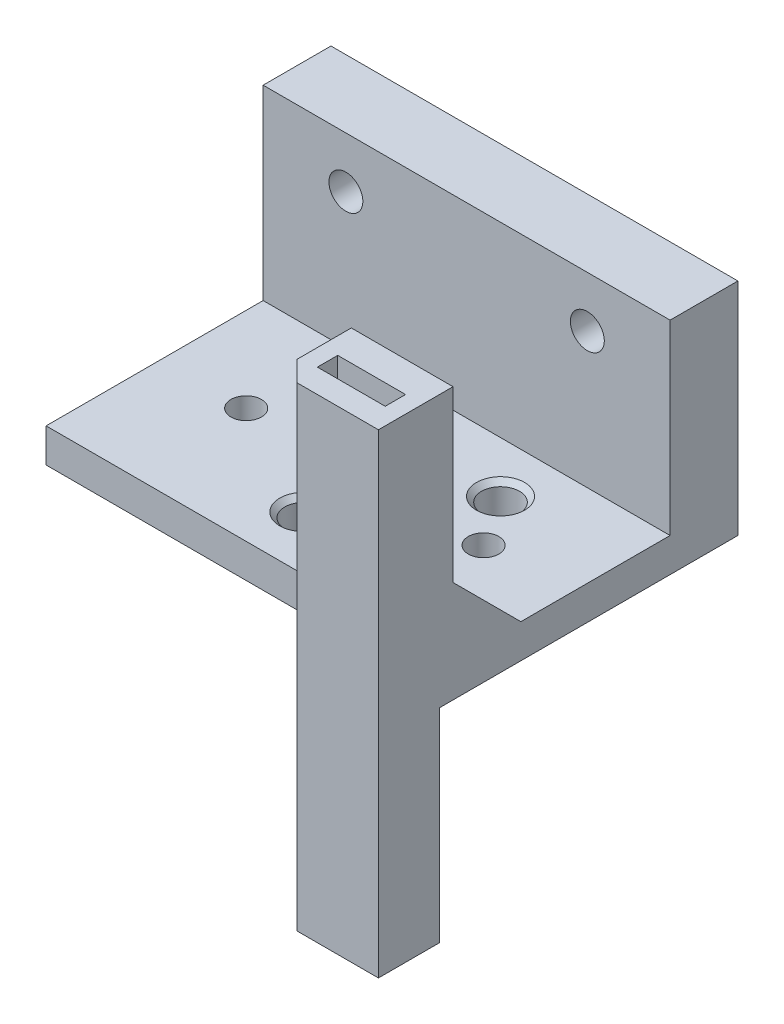
ISO-10303-21;
HEADER;
FILE_DESCRIPTION(('STEP AP214'),'2;1');
FILE_NAME('part.step','',(''),(''),'','','');
FILE_SCHEMA(('AUTOMOTIVE_DESIGN { 1 0 10303 214 1 1 1 1 }'));
ENDSEC;
DATA;
#1=APPLICATION_CONTEXT('core data for automotive mechanical design processes');
#2=APPLICATION_PROTOCOL_DEFINITION('international standard','automotive_design',2000,#1);
#3=PRODUCT_CONTEXT('',#1,'mechanical');
#4=PRODUCT('Part','Part','',(#3));
#5=PRODUCT_RELATED_PRODUCT_CATEGORY('part','',(#4));
#6=PRODUCT_DEFINITION_FORMATION('','',#4);
#7=PRODUCT_DEFINITION_CONTEXT('part definition',#1,'design');
#8=PRODUCT_DEFINITION('design','',#6,#7);
#9=PRODUCT_DEFINITION_SHAPE('','',#8);
#10=(LENGTH_UNIT() NAMED_UNIT(*) SI_UNIT(.MILLI.,.METRE.));
#11=(NAMED_UNIT(*) PLANE_ANGLE_UNIT() SI_UNIT($,.RADIAN.));
#12=(NAMED_UNIT(*) SI_UNIT($,.STERADIAN.) SOLID_ANGLE_UNIT());
#13=UNCERTAINTY_MEASURE_WITH_UNIT(LENGTH_MEASURE(1.E-05),#10,'distance_accuracy_value','');
#14=(GEOMETRIC_REPRESENTATION_CONTEXT(3) GLOBAL_UNCERTAINTY_ASSIGNED_CONTEXT((#13)) GLOBAL_UNIT_ASSIGNED_CONTEXT((#10,
#11,#12)) REPRESENTATION_CONTEXT('',''));
#15=CARTESIAN_POINT('',(0.,0.,0.));
#16=DIRECTION('',(0.,0.,1.));
#17=DIRECTION('',(1.,0.,0.));
#18=AXIS2_PLACEMENT_3D('',#15,#16,#17);
#19=CARTESIAN_POINT('',(0.,5.,0.));
#20=DIRECTION('',(0.,-1.,0.));
#21=DIRECTION('',(0.,0.,-1.));
#22=AXIS2_PLACEMENT_3D('',#19,#20,#21);
#23=PLANE('',#22);
#24=CARTESIAN_POINT('',(-17.5,5.,-15.));
#25=DIRECTION('',(0.,1.,0.));
#26=DIRECTION('',(0.,0.,1.));
#27=AXIS2_PLACEMENT_3D('',#24,#25,#26);
#28=CIRCLE('',#27,2.25);
#29=CARTESIAN_POINT('',(-17.5,5.,-12.75));
#30=VERTEX_POINT('',#29);
#31=EDGE_CURVE('E223',#30,#30,#28,.T.);
#32=ORIENTED_EDGE('',*,*,#31,.F.);
#33=EDGE_LOOP('',(#32));
#34=FACE_BOUND('',#33,.T.);
#35=CARTESIAN_POINT('',(17.5,5.,-15.));
#36=DIRECTION('',(0.,1.,0.));
#37=DIRECTION('',(0.,0.,1.));
#38=AXIS2_PLACEMENT_3D('',#35,#36,#37);
#39=CIRCLE('',#38,2.25);
#40=CARTESIAN_POINT('',(17.5,5.,-12.75));
#41=VERTEX_POINT('',#40);
#42=EDGE_CURVE('E215',#41,#41,#39,.T.);
#43=ORIENTED_EDGE('',*,*,#42,.F.);
#44=EDGE_LOOP('',(#43));
#45=FACE_BOUND('',#44,.T.);
#46=CARTESIAN_POINT('',(12.5,5.,-22.5));
#47=DIRECTION('',(0.,-1.,0.));
#48=DIRECTION('',(0.,0.,-1.));
#49=AXIS2_PLACEMENT_3D('',#46,#47,#48);
#50=CIRCLE('',#49,3.55000000000002);
#51=CARTESIAN_POINT('',(12.5,5.,-26.05));
#52=VERTEX_POINT('',#51);
#53=EDGE_CURVE('E285',#52,#52,#50,.T.);
#54=ORIENTED_EDGE('',*,*,#53,.T.);
#55=EDGE_LOOP('',(#54));
#56=FACE_BOUND('',#55,.T.);
#57=CARTESIAN_POINT('',(-12.5,5.,-22.5));
#58=DIRECTION('',(0.,-1.,0.));
#59=DIRECTION('',(0.,0.,-1.));
#60=AXIS2_PLACEMENT_3D('',#57,#58,#59);
#61=CIRCLE('',#60,3.55000000000002);
#62=CARTESIAN_POINT('',(-12.5,5.,-26.05));
#63=VERTEX_POINT('',#62);
#64=EDGE_CURVE('E289',#63,#63,#61,.T.);
#65=ORIENTED_EDGE('',*,*,#64,.T.);
#66=EDGE_LOOP('',(#65));
#67=FACE_BOUND('',#66,.T.);
#68=CARTESIAN_POINT('',(0.,5.,-6.));
#69=DIRECTION('',(0.,-1.,0.));
#70=DIRECTION('',(0.,0.,-1.));
#71=AXIS2_PLACEMENT_3D('',#68,#69,#70);
#72=CIRCLE('',#71,3.55000000000002);
#73=CARTESIAN_POINT('',(0.,5.,-9.55000000000002));
#74=VERTEX_POINT('',#73);
#75=EDGE_CURVE('E293',#74,#74,#72,.T.);
#76=ORIENTED_EDGE('',*,*,#75,.T.);
#77=EDGE_LOOP('',(#76));
#78=FACE_BOUND('',#77,.T.);
#79=DIRECTION('',(1.,0.,0.));
#80=VECTOR('',#79,1.);
#81=CARTESIAN_POINT('',(0.,5.,-8.00000000000008));
#82=LINE('',#81,#80);
#83=CARTESIAN_POINT('',(9.99999999999997,5.,-8.00000000000008));
#84=VERTEX_POINT('',#83);
#85=CARTESIAN_POINT('',(30.,5.,-8.00000000000005));
#86=VERTEX_POINT('',#85);
#87=EDGE_CURVE('E62',#84,#86,#82,.T.);
#88=ORIENTED_EDGE('',*,*,#87,.T.);
#89=DIRECTION('',(0.,0.,1.));
#90=VECTOR('',#89,1.);
#91=CARTESIAN_POINT('',(30.,5.,-30.));
#92=LINE('',#91,#90);
#93=CARTESIAN_POINT('',(30.,5.,-30.));
#94=VERTEX_POINT('',#93);
#95=EDGE_CURVE('E195',#94,#86,#92,.T.);
#96=ORIENTED_EDGE('',*,*,#95,.F.);
#97=DIRECTION('',(1.,0.,0.));
#98=VECTOR('',#97,1.);
#99=CARTESIAN_POINT('',(-30.,5.,-30.));
#100=LINE('',#99,#98);
#101=CARTESIAN_POINT('',(-30.,5.,-30.));
#102=VERTEX_POINT('',#101);
#103=EDGE_CURVE('E190',#102,#94,#100,.T.);
#104=ORIENTED_EDGE('',*,*,#103,.F.);
#105=DIRECTION('',(0.,0.,1.));
#106=VECTOR('',#105,1.);
#107=CARTESIAN_POINT('',(-30.,5.,0.));
#108=LINE('',#107,#106);
#109=CARTESIAN_POINT('',(-30.,5.,2.));
#110=VERTEX_POINT('',#109);
#111=EDGE_CURVE('E243',#102,#110,#108,.T.);
#112=ORIENTED_EDGE('',*,*,#111,.T.);
#113=DIRECTION('',(1.,0.,0.));
#114=VECTOR('',#113,1.);
#115=CARTESIAN_POINT('',(-30.,5.,2.));
#116=LINE('',#115,#114);
#117=CARTESIAN_POINT('',(9.99999999999997,5.,2.));
#118=VERTEX_POINT('',#117);
#119=EDGE_CURVE('E246',#110,#118,#116,.T.);
#120=ORIENTED_EDGE('',*,*,#119,.T.);
#121=DIRECTION('',(0.,0.,-1.));
#122=VECTOR('',#121,1.);
#123=CARTESIAN_POINT('',(9.99999999999997,5.,0.));
#124=LINE('',#123,#122);
#125=EDGE_CURVE('E328',#118,#84,#124,.T.);
#126=ORIENTED_EDGE('',*,*,#125,.T.);
#127=EDGE_LOOP('',(#88,#96,#104,#112,#120,#126));
#128=FACE_BOUND('',#127,.T.);
#129=ADVANCED_FACE('F39',(#34,#45,#56,#67,#78,#128),#23,.F.);
#130=CARTESIAN_POINT('',(-30.,32.5,-30.));
#131=DIRECTION('',(0.,0.,-1.));
#132=DIRECTION('',(-1.,0.,0.));
#133=AXIS2_PLACEMENT_3D('',#130,#131,#132);
#134=PLANE('',#133);
#135=CARTESIAN_POINT('',(-17.8,25.,-30.));
#136=DIRECTION('',(0.,0.,-1.));
#137=DIRECTION('',(-1.,0.,0.));
#138=AXIS2_PLACEMENT_3D('',#135,#136,#137);
#139=CIRCLE('',#138,2.49999999999999);
#140=CARTESIAN_POINT('',(-20.3,25.,-30.));
#141=VERTEX_POINT('',#140);
#142=EDGE_CURVE('E274',#141,#141,#139,.T.);
#143=ORIENTED_EDGE('',*,*,#142,.T.);
#144=EDGE_LOOP('',(#143));
#145=FACE_BOUND('',#144,.T.);
#146=CARTESIAN_POINT('',(17.8,25.,-30.));
#147=DIRECTION('',(0.,0.,-1.));
#148=DIRECTION('',(-1.,0.,0.));
#149=AXIS2_PLACEMENT_3D('',#146,#147,#148);
#150=CIRCLE('',#149,2.5);
#151=CARTESIAN_POINT('',(15.3,25.,-30.));
#152=VERTEX_POINT('',#151);
#153=EDGE_CURVE('E213',#152,#152,#150,.T.);
#154=ORIENTED_EDGE('',*,*,#153,.T.);
#155=EDGE_LOOP('',(#154));
#156=FACE_BOUND('',#155,.T.);
#157=ORIENTED_EDGE('',*,*,#103,.T.);
#158=DIRECTION('',(0.,-1.,0.));
#159=VECTOR('',#158,1.);
#160=CARTESIAN_POINT('',(30.,32.5,-30.));
#161=LINE('',#160,#159);
#162=CARTESIAN_POINT('',(30.,32.5,-30.));
#163=VERTEX_POINT('',#162);
#164=EDGE_CURVE('E188',#163,#94,#161,.T.);
#165=ORIENTED_EDGE('',*,*,#164,.F.);
#166=DIRECTION('',(1.,0.,0.));
#167=VECTOR('',#166,1.);
#168=CARTESIAN_POINT('',(-30.,32.5,-30.));
#169=LINE('',#168,#167);
#170=CARTESIAN_POINT('',(-30.,32.5,-30.));
#171=VERTEX_POINT('',#170);
#172=EDGE_CURVE('E173',#171,#163,#169,.T.);
#173=ORIENTED_EDGE('',*,*,#172,.F.);
#174=DIRECTION('',(0.,-1.,0.));
#175=VECTOR('',#174,1.);
#176=CARTESIAN_POINT('',(-30.,32.5,-30.));
#177=LINE('',#176,#175);
#178=EDGE_CURVE('E204',#171,#102,#177,.T.);
#179=ORIENTED_EDGE('',*,*,#178,.T.);
#180=EDGE_LOOP('',(#157,#165,#173,#179));
#181=FACE_BOUND('',#180,.T.);
#182=ADVANCED_FACE('F189',(#145,#156,#181),#134,.F.);
#183=CARTESIAN_POINT('',(0.,5.,-8.00000000000008));
#184=DIRECTION('',(0.,-0.707106781186552,0.707106781186544));
#185=DIRECTION('',(1.,0.,0.));
#186=AXIS2_PLACEMENT_3D('',#183,#184,#185);
#187=PLANE('',#186);
#188=DIRECTION('',(-1.,0.,0.));
#189=VECTOR('',#188,1.);
#190=CARTESIAN_POINT('',(30.,15.,2.));
#191=LINE('',#190,#189);
#192=CARTESIAN_POINT('',(30.,15.,2.));
#193=VERTEX_POINT('',#192);
#194=CARTESIAN_POINT('',(15.,15.,2.));
#195=VERTEX_POINT('',#194);
#196=EDGE_CURVE('E307',#193,#195,#191,.T.);
#197=ORIENTED_EDGE('',*,*,#196,.F.);
#198=DIRECTION('',(0.,0.707106781186544,0.707106781186551));
#199=VECTOR('',#198,1.);
#200=CARTESIAN_POINT('',(30.,5.,-8.00000000000005));
#201=LINE('',#200,#199);
#202=EDGE_CURVE('E468',#86,#193,#201,.T.);
#203=ORIENTED_EDGE('',*,*,#202,.F.);
#204=ORIENTED_EDGE('',*,*,#87,.F.);
#205=DIRECTION('',(0.577350269189628,0.577350269189622,0.577350269189628));
#206=VECTOR('',#205,1.);
#207=CARTESIAN_POINT('',(6.66666666666662,1.66666666666669,-11.3333333333334));
#208=LINE('',#207,#206);
#209=CARTESIAN_POINT('',(15.,9.99999999999998,-3.00000000000005));
#210=VERTEX_POINT('',#209);
#211=EDGE_CURVE('E48',#84,#210,#208,.T.);
#212=ORIENTED_EDGE('',*,*,#211,.T.);
#213=DIRECTION('',(0.,-0.707106781186544,-0.707106781186551));
#214=VECTOR('',#213,1.);
#215=CARTESIAN_POINT('',(15.,5.,-8.00000000000008));
#216=LINE('',#215,#214);
#217=EDGE_CURVE('E310',#195,#210,#216,.T.);
#218=ORIENTED_EDGE('',*,*,#217,.F.);
#219=EDGE_LOOP('',(#197,#203,#204,#212,#218));
#220=FACE_BOUND('',#219,.T.);
#221=ADVANCED_FACE('F508',(#220),#187,.F.);
#222=CARTESIAN_POINT('',(-30.,5.,2.));
#223=DIRECTION('',(0.,0.,-1.));
#224=DIRECTION('',(-1.,0.,0.));
#225=AXIS2_PLACEMENT_3D('',#222,#223,#224);
#226=PLANE('',#225);
#227=DIRECTION('',(1.,0.,0.));
#228=VECTOR('',#227,1.);
#229=CARTESIAN_POINT('',(-30.,0.,2.));
#230=LINE('',#229,#228);
#231=CARTESIAN_POINT('',(-30.,0.,2.));
#232=VERTEX_POINT('',#231);
#233=CARTESIAN_POINT('',(9.99999999999997,0.,2.));
#234=VERTEX_POINT('',#233);
#235=EDGE_CURVE('E258',#232,#234,#230,.T.);
#236=ORIENTED_EDGE('',*,*,#235,.T.);
#237=DIRECTION('',(0.,1.,0.));
#238=VECTOR('',#237,1.);
#239=CARTESIAN_POINT('',(9.99999999999997,5.,2.));
#240=LINE('',#239,#238);
#241=EDGE_CURVE('E325',#234,#118,#240,.T.);
#242=ORIENTED_EDGE('',*,*,#241,.T.);
#243=ORIENTED_EDGE('',*,*,#119,.F.);
#244=DIRECTION('',(0.,-1.,0.));
#245=VECTOR('',#244,1.);
#246=CARTESIAN_POINT('',(-30.,5.,2.));
#247=LINE('',#246,#245);
#248=EDGE_CURVE('E251',#110,#232,#247,.T.);
#249=ORIENTED_EDGE('',*,*,#248,.T.);
#250=EDGE_LOOP('',(#236,#242,#243,#249));
#251=FACE_BOUND('',#250,.T.);
#252=ADVANCED_FACE('F536',(#251),#226,.F.);
#253=CARTESIAN_POINT('',(0.,0.,0.));
#254=DIRECTION('',(0.,-1.,0.));
#255=DIRECTION('',(0.,0.,-1.));
#256=AXIS2_PLACEMENT_3D('',#253,#254,#255);
#257=PLANE('',#256);
#258=DIRECTION('',(-0.707106781186551,0.,-0.707106781186544));
#259=VECTOR('',#258,1.);
#260=CARTESIAN_POINT('',(15.,0.,6.99999999999998));
#261=LINE('',#260,#259);
#262=CARTESIAN_POINT('',(15.,0.,6.99999999999998));
#263=VERTEX_POINT('',#262);
#264=EDGE_CURVE('E331',#263,#234,#261,.T.);
#265=ORIENTED_EDGE('',*,*,#264,.T.);
#266=ORIENTED_EDGE('',*,*,#235,.F.);
#267=DIRECTION('',(0.,0.,1.));
#268=VECTOR('',#267,1.);
#269=CARTESIAN_POINT('',(-30.,0.,0.));
#270=LINE('',#269,#268);
#271=CARTESIAN_POINT('',(-30.,0.,-40.));
#272=VERTEX_POINT('',#271);
#273=EDGE_CURVE('E255',#272,#232,#270,.T.);
#274=ORIENTED_EDGE('',*,*,#273,.F.);
#275=DIRECTION('',(-1.,0.,0.));
#276=VECTOR('',#275,1.);
#277=CARTESIAN_POINT('',(-30.,0.,-40.));
#278=LINE('',#277,#276);
#279=CARTESIAN_POINT('',(30.,0.,-40.));
#280=VERTEX_POINT('',#279);
#281=EDGE_CURVE('E242',#280,#272,#278,.T.);
#282=ORIENTED_EDGE('',*,*,#281,.F.);
#283=DIRECTION('',(0.,0.,-1.));
#284=VECTOR('',#283,1.);
#285=CARTESIAN_POINT('',(30.,0.,2.));
#286=LINE('',#285,#284);
#287=CARTESIAN_POINT('',(30.,0.,4.));
#288=VERTEX_POINT('',#287);
#289=EDGE_CURVE('E247',#288,#280,#286,.T.);
#290=ORIENTED_EDGE('',*,*,#289,.F.);
#291=DIRECTION('',(1.,0.,0.));
#292=VECTOR('',#291,1.);
#293=CARTESIAN_POINT('',(-30.,0.,4.));
#294=LINE('',#293,#292);
#295=CARTESIAN_POINT('',(15.,0.,4.));
#296=VERTEX_POINT('',#295);
#297=EDGE_CURVE('E349',#296,#288,#294,.T.);
#298=ORIENTED_EDGE('',*,*,#297,.F.);
#299=DIRECTION('',(0.,0.,-1.));
#300=VECTOR('',#299,1.);
#301=CARTESIAN_POINT('',(15.,0.,0.));
#302=LINE('',#301,#300);
#303=EDGE_CURVE('E321',#263,#296,#302,.T.);
#304=ORIENTED_EDGE('',*,*,#303,.F.);
#305=EDGE_LOOP('',(#265,#266,#274,#282,#290,#298,#304));
#306=FACE_BOUND('',#305,.T.);
#307=CARTESIAN_POINT('',(-17.5,0.,-15.));
#308=DIRECTION('',(0.,1.,0.));
#309=DIRECTION('',(0.,0.,1.));
#310=AXIS2_PLACEMENT_3D('',#307,#308,#309);
#311=CIRCLE('',#310,2.25);
#312=CARTESIAN_POINT('',(-17.5,0.,-12.75));
#313=VERTEX_POINT('',#312);
#314=EDGE_CURVE('E219',#313,#313,#311,.T.);
#315=ORIENTED_EDGE('',*,*,#314,.T.);
#316=EDGE_LOOP('',(#315));
#317=FACE_BOUND('',#316,.T.);
#318=CARTESIAN_POINT('',(12.5,0.,-22.5));
#319=DIRECTION('',(0.,1.,0.));
#320=DIRECTION('',(0.,0.,1.));
#321=AXIS2_PLACEMENT_3D('',#318,#319,#320);
#322=CIRCLE('',#321,2.8);
#323=CARTESIAN_POINT('',(12.5,0.,-19.7));
#324=VERTEX_POINT('',#323);
#325=EDGE_CURVE('E234',#324,#324,#322,.T.);
#326=ORIENTED_EDGE('',*,*,#325,.T.);
#327=EDGE_LOOP('',(#326));
#328=FACE_BOUND('',#327,.T.);
#329=CARTESIAN_POINT('',(-12.5,0.,-22.5));
#330=DIRECTION('',(0.,1.,0.));
#331=DIRECTION('',(0.,0.,1.));
#332=AXIS2_PLACEMENT_3D('',#329,#330,#331);
#333=CIRCLE('',#332,2.8);
#334=CARTESIAN_POINT('',(-12.5,0.,-19.7));
#335=VERTEX_POINT('',#334);
#336=EDGE_CURVE('E238',#335,#335,#333,.T.);
#337=ORIENTED_EDGE('',*,*,#336,.T.);
#338=EDGE_LOOP('',(#337));
#339=FACE_BOUND('',#338,.T.);
#340=CARTESIAN_POINT('',(0.,0.,-6.));
#341=DIRECTION('',(0.,1.,0.));
#342=DIRECTION('',(0.,0.,1.));
#343=AXIS2_PLACEMENT_3D('',#340,#341,#342);
#344=CIRCLE('',#343,2.8);
#345=CARTESIAN_POINT('',(0.,0.,-3.2));
#346=VERTEX_POINT('',#345);
#347=EDGE_CURVE('E227',#346,#346,#344,.T.);
#348=ORIENTED_EDGE('',*,*,#347,.T.);
#349=EDGE_LOOP('',(#348));
#350=FACE_BOUND('',#349,.T.);
#351=CARTESIAN_POINT('',(17.5,0.,-15.));
#352=DIRECTION('',(0.,1.,0.));
#353=DIRECTION('',(0.,0.,1.));
#354=AXIS2_PLACEMENT_3D('',#351,#352,#353);
#355=CIRCLE('',#354,2.25);
#356=CARTESIAN_POINT('',(17.5,0.,-12.75));
#357=VERTEX_POINT('',#356);
#358=EDGE_CURVE('E207',#357,#357,#355,.T.);
#359=ORIENTED_EDGE('',*,*,#358,.T.);
#360=EDGE_LOOP('',(#359));
#361=FACE_BOUND('',#360,.T.);
#362=ADVANCED_FACE('F493',(#306,#317,#328,#339,#350,#361),#257,.T.);
#363=CARTESIAN_POINT('',(-30.,5.,-40.));
#364=DIRECTION('',(0.,0.,1.));
#365=DIRECTION('',(1.,0.,0.));
#366=AXIS2_PLACEMENT_3D('',#363,#364,#365);
#367=PLANE('',#366);
#368=CARTESIAN_POINT('',(0.,25.,-40.));
#369=DIRECTION('',(0.,0.,-1.));
#370=DIRECTION('',(-1.,0.,0.));
#371=AXIS2_PLACEMENT_3D('',#368,#369,#370);
#372=CIRCLE('',#371,2.5);
#373=CARTESIAN_POINT('',(-2.5,25.,-40.));
#374=VERTEX_POINT('',#373);
#375=EDGE_CURVE('E474',#374,#374,#372,.T.);
#376=ORIENTED_EDGE('',*,*,#375,.F.);
#377=EDGE_LOOP('',(#376));
#378=FACE_BOUND('',#377,.T.);
#379=CARTESIAN_POINT('',(17.8,25.,-40.));
#380=DIRECTION('',(0.,0.,-1.));
#381=DIRECTION('',(-1.,0.,0.));
#382=AXIS2_PLACEMENT_3D('',#379,#380,#381);
#383=CIRCLE('',#382,2.5);
#384=CARTESIAN_POINT('',(15.3,25.,-40.));
#385=VERTEX_POINT('',#384);
#386=EDGE_CURVE('E278',#385,#385,#383,.T.);
#387=ORIENTED_EDGE('',*,*,#386,.F.);
#388=EDGE_LOOP('',(#387));
#389=FACE_BOUND('',#388,.T.);
#390=CARTESIAN_POINT('',(-17.8,25.,-40.));
#391=DIRECTION('',(0.,0.,-1.));
#392=DIRECTION('',(-1.,0.,0.));
#393=AXIS2_PLACEMENT_3D('',#390,#391,#392);
#394=CIRCLE('',#393,2.49999999999999);
#395=CARTESIAN_POINT('',(-20.3,25.,-40.));
#396=VERTEX_POINT('',#395);
#397=EDGE_CURVE('E435',#396,#396,#394,.T.);
#398=ORIENTED_EDGE('',*,*,#397,.F.);
#399=EDGE_LOOP('',(#398));
#400=FACE_BOUND('',#399,.T.);
#401=ORIENTED_EDGE('',*,*,#281,.T.);
#402=DIRECTION('',(0.,-1.,0.));
#403=VECTOR('',#402,1.);
#404=CARTESIAN_POINT('',(-30.,5.,-40.));
#405=LINE('',#404,#403);
#406=CARTESIAN_POINT('',(-30.,32.5,-40.));
#407=VERTEX_POINT('',#406);
#408=EDGE_CURVE('E267',#407,#272,#405,.T.);
#409=ORIENTED_EDGE('',*,*,#408,.F.);
#410=DIRECTION('',(-1.,0.,0.));
#411=VECTOR('',#410,1.);
#412=CARTESIAN_POINT('',(30.,32.5,-40.));
#413=LINE('',#412,#411);
#414=CARTESIAN_POINT('',(30.,32.5,-40.));
#415=VERTEX_POINT('',#414);
#416=EDGE_CURVE('E212',#415,#407,#413,.T.);
#417=ORIENTED_EDGE('',*,*,#416,.F.);
#418=DIRECTION('',(0.,-1.,0.));
#419=VECTOR('',#418,1.);
#420=CARTESIAN_POINT('',(30.,5.,-40.));
#421=LINE('',#420,#419);
#422=EDGE_CURVE('E201',#415,#280,#421,.T.);
#423=ORIENTED_EDGE('',*,*,#422,.T.);
#424=EDGE_LOOP('',(#401,#409,#417,#423));
#425=FACE_BOUND('',#424,.T.);
#426=ADVANCED_FACE('F458',(#378,#389,#400,#425),#367,.F.);
#427=CARTESIAN_POINT('',(-30.,5.,0.));
#428=DIRECTION('',(1.,0.,0.));
#429=DIRECTION('',(0.,0.,-1.));
#430=AXIS2_PLACEMENT_3D('',#427,#428,#429);
#431=PLANE('',#430);
#432=ORIENTED_EDGE('',*,*,#273,.T.);
#433=ORIENTED_EDGE('',*,*,#248,.F.);
#434=ORIENTED_EDGE('',*,*,#111,.F.);
#435=ORIENTED_EDGE('',*,*,#178,.F.);
#436=DIRECTION('',(0.,0.,1.));
#437=VECTOR('',#436,1.);
#438=CARTESIAN_POINT('',(-30.,32.5,-40.));
#439=LINE('',#438,#437);
#440=EDGE_CURVE('E181',#407,#171,#439,.T.);
#441=ORIENTED_EDGE('',*,*,#440,.F.);
#442=ORIENTED_EDGE('',*,*,#408,.T.);
#443=EDGE_LOOP('',(#432,#433,#434,#435,#441,#442));
#444=FACE_BOUND('',#443,.T.);
#445=ADVANCED_FACE('F461',(#444),#431,.F.);
#446=CARTESIAN_POINT('',(30.,5.,2.));
#447=DIRECTION('',(-1.,0.,0.));
#448=DIRECTION('',(0.,0.,1.));
#449=AXIS2_PLACEMENT_3D('',#446,#447,#448);
#450=PLANE('',#449);
#451=ORIENTED_EDGE('',*,*,#202,.T.);
#452=DIRECTION('',(0.,-1.,0.));
#453=VECTOR('',#452,1.);
#454=CARTESIAN_POINT('',(30.,40.,2.));
#455=LINE('',#454,#453);
#456=CARTESIAN_POINT('',(30.,40.,2.));
#457=VERTEX_POINT('',#456);
#458=EDGE_CURVE('E432',#457,#193,#455,.T.);
#459=ORIENTED_EDGE('',*,*,#458,.F.);
#460=DIRECTION('',(0.,0.,1.));
#461=VECTOR('',#460,1.);
#462=CARTESIAN_POINT('',(30.,40.,2.));
#463=LINE('',#462,#461);
#464=CARTESIAN_POINT('',(30.,40.,13.));
#465=VERTEX_POINT('',#464);
#466=EDGE_CURVE('E403',#457,#465,#463,.T.);
#467=ORIENTED_EDGE('',*,*,#466,.T.);
#468=DIRECTION('',(0.,-1.,0.));
#469=VECTOR('',#468,1.);
#470=CARTESIAN_POINT('',(30.,40.,13.));
#471=LINE('',#470,#469);
#472=CARTESIAN_POINT('',(30.,-30.,13.));
#473=VERTEX_POINT('',#472);
#474=EDGE_CURVE('E431',#465,#473,#471,.T.);
#475=ORIENTED_EDGE('',*,*,#474,.T.);
#476=DIRECTION('',(0.,0.,1.));
#477=VECTOR('',#476,1.);
#478=CARTESIAN_POINT('',(30.,-30.,2.));
#479=LINE('',#478,#477);
#480=CARTESIAN_POINT('',(30.,-30.,4.));
#481=VERTEX_POINT('',#480);
#482=EDGE_CURVE('E368',#481,#473,#479,.T.);
#483=ORIENTED_EDGE('',*,*,#482,.F.);
#484=DIRECTION('',(0.,-1.,0.));
#485=VECTOR('',#484,1.);
#486=CARTESIAN_POINT('',(30.,0.,4.));
#487=LINE('',#486,#485);
#488=EDGE_CURVE('E54',#288,#481,#487,.T.);
#489=ORIENTED_EDGE('',*,*,#488,.F.);
#490=ORIENTED_EDGE('',*,*,#289,.T.);
#491=ORIENTED_EDGE('',*,*,#422,.F.);
#492=DIRECTION('',(0.,0.,-1.));
#493=VECTOR('',#492,1.);
#494=CARTESIAN_POINT('',(30.,32.5,-40.));
#495=LINE('',#494,#493);
#496=EDGE_CURVE('E178',#163,#415,#495,.T.);
#497=ORIENTED_EDGE('',*,*,#496,.F.);
#498=ORIENTED_EDGE('',*,*,#164,.T.);
#499=ORIENTED_EDGE('',*,*,#95,.T.);
#500=EDGE_LOOP('',(#451,#459,#467,#475,#483,#489,#490,#491,#497,#498,#499));
#501=FACE_BOUND('',#500,.T.);
#502=ADVANCED_FACE('F199',(#501),#450,.F.);
#503=CARTESIAN_POINT('',(-12.5,5.,-22.5));
#504=DIRECTION('',(0.,-1.,0.));
#505=DIRECTION('',(0.,0.,-1.));
#506=AXIS2_PLACEMENT_3D('',#503,#504,#505);
#507=CYLINDRICAL_SURFACE('',#506,2.8);
#508=CARTESIAN_POINT('',(-12.5,4.24999999999999,-22.5));
#509=DIRECTION('',(0.,-1.,0.));
#510=DIRECTION('',(0.,0.,-1.));
#511=AXIS2_PLACEMENT_3D('',#508,#509,#510);
#512=CIRCLE('',#511,2.8);
#513=CARTESIAN_POINT('',(-12.5,4.24999999999999,-25.3));
#514=VERTEX_POINT('',#513);
#515=EDGE_CURVE('E297',#514,#514,#512,.F.);
#516=ORIENTED_EDGE('',*,*,#515,.T.);
#517=EDGE_LOOP('',(#516));
#518=FACE_BOUND('',#517,.T.);
#519=ORIENTED_EDGE('',*,*,#336,.F.);
#520=EDGE_LOOP('',(#519));
#521=FACE_BOUND('',#520,.T.);
#522=ADVANCED_FACE('F532',(#518,#521),#507,.F.);
#523=CARTESIAN_POINT('',(12.5,5.,-22.5));
#524=DIRECTION('',(0.,-1.,0.));
#525=DIRECTION('',(0.,0.,-1.));
#526=AXIS2_PLACEMENT_3D('',#523,#524,#525);
#527=CYLINDRICAL_SURFACE('',#526,2.8);
#528=CARTESIAN_POINT('',(12.5,4.24999999999999,-22.5));
#529=DIRECTION('',(0.,-1.,0.));
#530=DIRECTION('',(0.,0.,-1.));
#531=AXIS2_PLACEMENT_3D('',#528,#529,#530);
#532=CIRCLE('',#531,2.8);
#533=CARTESIAN_POINT('',(12.5,4.24999999999999,-25.3));
#534=VERTEX_POINT('',#533);
#535=EDGE_CURVE('E301',#534,#534,#532,.F.);
#536=ORIENTED_EDGE('',*,*,#535,.T.);
#537=EDGE_LOOP('',(#536));
#538=FACE_BOUND('',#537,.T.);
#539=ORIENTED_EDGE('',*,*,#325,.F.);
#540=EDGE_LOOP('',(#539));
#541=FACE_BOUND('',#540,.T.);
#542=ADVANCED_FACE('F618',(#538,#541),#527,.F.);
#543=CARTESIAN_POINT('',(0.,5.,-6.));
#544=DIRECTION('',(0.,-1.,0.));
#545=DIRECTION('',(0.,0.,-1.));
#546=AXIS2_PLACEMENT_3D('',#543,#544,#545);
#547=CYLINDRICAL_SURFACE('',#546,2.8);
#548=CARTESIAN_POINT('',(0.,4.24999999999999,-6.));
#549=DIRECTION('',(0.,-1.,0.));
#550=DIRECTION('',(0.,0.,-1.));
#551=AXIS2_PLACEMENT_3D('',#548,#549,#550);
#552=CIRCLE('',#551,2.8);
#553=CARTESIAN_POINT('',(0.,4.24999999999999,-8.8));
#554=VERTEX_POINT('',#553);
#555=EDGE_CURVE('E273',#554,#554,#552,.F.);
#556=ORIENTED_EDGE('',*,*,#555,.T.);
#557=EDGE_LOOP('',(#556));
#558=FACE_BOUND('',#557,.T.);
#559=ORIENTED_EDGE('',*,*,#347,.F.);
#560=EDGE_LOOP('',(#559));
#561=FACE_BOUND('',#560,.T.);
#562=ADVANCED_FACE('F613',(#558,#561),#547,.F.);
#563=CARTESIAN_POINT('',(-17.5,5.,-15.));
#564=DIRECTION('',(0.,-1.,0.));
#565=DIRECTION('',(0.,0.,-1.));
#566=AXIS2_PLACEMENT_3D('',#563,#564,#565);
#567=CYLINDRICAL_SURFACE('',#566,2.25);
#568=ORIENTED_EDGE('',*,*,#31,.T.);
#569=EDGE_LOOP('',(#568));
#570=FACE_BOUND('',#569,.T.);
#571=ORIENTED_EDGE('',*,*,#314,.F.);
#572=EDGE_LOOP('',(#571));
#573=FACE_BOUND('',#572,.T.);
#574=ADVANCED_FACE('F605',(#570,#573),#567,.F.);
#575=CARTESIAN_POINT('',(17.5,5.,-15.));
#576=DIRECTION('',(0.,-1.,0.));
#577=DIRECTION('',(0.,0.,-1.));
#578=AXIS2_PLACEMENT_3D('',#575,#576,#577);
#579=CYLINDRICAL_SURFACE('',#578,2.25);
#580=ORIENTED_EDGE('',*,*,#42,.T.);
#581=EDGE_LOOP('',(#580));
#582=FACE_BOUND('',#581,.T.);
#583=ORIENTED_EDGE('',*,*,#358,.F.);
#584=EDGE_LOOP('',(#583));
#585=FACE_BOUND('',#584,.T.);
#586=ADVANCED_FACE('F603',(#582,#585),#579,.F.);
#587=CARTESIAN_POINT('',(0.,32.5,0.));
#588=DIRECTION('',(0.,1.,0.));
#589=DIRECTION('',(0.,0.,1.));
#590=AXIS2_PLACEMENT_3D('',#587,#588,#589);
#591=PLANE('',#590);
#592=ORIENTED_EDGE('',*,*,#172,.T.);
#593=ORIENTED_EDGE('',*,*,#496,.T.);
#594=ORIENTED_EDGE('',*,*,#416,.T.);
#595=ORIENTED_EDGE('',*,*,#440,.T.);
#596=EDGE_LOOP('',(#592,#593,#594,#595));
#597=FACE_BOUND('',#596,.T.);
#598=ADVANCED_FACE('F175',(#597),#591,.T.);
#599=CARTESIAN_POINT('',(-17.8,25.,2.00000000000002));
#600=DIRECTION('',(0.,0.,-1.));
#601=DIRECTION('',(-1.,0.,0.));
#602=AXIS2_PLACEMENT_3D('',#599,#600,#601);
#603=CYLINDRICAL_SURFACE('',#602,2.49999999999999);
#604=ORIENTED_EDGE('',*,*,#397,.T.);
#605=EDGE_LOOP('',(#604));
#606=FACE_BOUND('',#605,.T.);
#607=ORIENTED_EDGE('',*,*,#142,.F.);
#608=EDGE_LOOP('',(#607));
#609=FACE_BOUND('',#608,.T.);
#610=ADVANCED_FACE('F499',(#606,#609),#603,.F.);
#611=CARTESIAN_POINT('',(17.8,25.,2.00000000000004));
#612=DIRECTION('',(0.,0.,-1.));
#613=DIRECTION('',(-1.,0.,0.));
#614=AXIS2_PLACEMENT_3D('',#611,#612,#613);
#615=CYLINDRICAL_SURFACE('',#614,2.5);
#616=ORIENTED_EDGE('',*,*,#386,.T.);
#617=EDGE_LOOP('',(#616));
#618=FACE_BOUND('',#617,.T.);
#619=ORIENTED_EDGE('',*,*,#153,.F.);
#620=EDGE_LOOP('',(#619));
#621=FACE_BOUND('',#620,.T.);
#622=ADVANCED_FACE('F502',(#618,#621),#615,.F.);
#623=CARTESIAN_POINT('',(0.,4.24999999999999,-6.));
#624=DIRECTION('',(0.,1.,0.));
#625=DIRECTION('',(0.,0.,1.));
#626=AXIS2_PLACEMENT_3D('',#623,#624,#625);
#627=CONICAL_SURFACE('',#626,2.8,0.785398163397451);
#628=ORIENTED_EDGE('',*,*,#75,.F.);
#629=EDGE_LOOP('',(#628));
#630=FACE_BOUND('',#629,.T.);
#631=ORIENTED_EDGE('',*,*,#555,.F.);
#632=EDGE_LOOP('',(#631));
#633=FACE_BOUND('',#632,.T.);
#634=ADVANCED_FACE('F513',(#630,#633),#627,.F.);
#635=CARTESIAN_POINT('',(-12.5,4.24999999999999,-22.5));
#636=DIRECTION('',(0.,1.,0.));
#637=DIRECTION('',(0.,0.,1.));
#638=AXIS2_PLACEMENT_3D('',#635,#636,#637);
#639=CONICAL_SURFACE('',#638,2.8,0.785398163397451);
#640=ORIENTED_EDGE('',*,*,#64,.F.);
#641=EDGE_LOOP('',(#640));
#642=FACE_BOUND('',#641,.T.);
#643=ORIENTED_EDGE('',*,*,#515,.F.);
#644=EDGE_LOOP('',(#643));
#645=FACE_BOUND('',#644,.T.);
#646=ADVANCED_FACE('F519',(#642,#645),#639,.F.);
#647=CARTESIAN_POINT('',(12.5,4.24999999999999,-22.5));
#648=DIRECTION('',(0.,1.,0.));
#649=DIRECTION('',(0.,0.,1.));
#650=AXIS2_PLACEMENT_3D('',#647,#648,#649);
#651=CONICAL_SURFACE('',#650,2.8,0.785398163397451);
#652=ORIENTED_EDGE('',*,*,#53,.F.);
#653=EDGE_LOOP('',(#652));
#654=FACE_BOUND('',#653,.T.);
#655=ORIENTED_EDGE('',*,*,#535,.F.);
#656=EDGE_LOOP('',(#655));
#657=FACE_BOUND('',#656,.T.);
#658=ADVANCED_FACE('F547',(#654,#657),#651,.F.);
#659=CARTESIAN_POINT('',(30.,40.,2.));
#660=DIRECTION('',(0.,0.,-1.));
#661=DIRECTION('',(-1.,0.,0.));
#662=AXIS2_PLACEMENT_3D('',#659,#660,#661);
#663=PLANE('',#662);
#664=ORIENTED_EDGE('',*,*,#458,.T.);
#665=ORIENTED_EDGE('',*,*,#196,.T.);
#666=DIRECTION('',(0.,-1.,0.));
#667=VECTOR('',#666,1.);
#668=CARTESIAN_POINT('',(15.,40.,2.));
#669=LINE('',#668,#667);
#670=CARTESIAN_POINT('',(15.,40.,2.));
#671=VERTEX_POINT('',#670);
#672=EDGE_CURVE('E436',#671,#195,#669,.T.);
#673=ORIENTED_EDGE('',*,*,#672,.F.);
#674=DIRECTION('',(1.,0.,0.));
#675=VECTOR('',#674,1.);
#676=CARTESIAN_POINT('',(30.,40.,2.));
#677=LINE('',#676,#675);
#678=EDGE_CURVE('E427',#671,#457,#677,.T.);
#679=ORIENTED_EDGE('',*,*,#678,.T.);
#680=EDGE_LOOP('',(#664,#665,#673,#679));
#681=FACE_BOUND('',#680,.T.);
#682=ADVANCED_FACE('F551',(#681),#663,.T.);
#683=CARTESIAN_POINT('',(15.,40.,2.));
#684=DIRECTION('',(-1.,0.,0.));
#685=DIRECTION('',(0.,0.,1.));
#686=AXIS2_PLACEMENT_3D('',#683,#684,#685);
#687=PLANE('',#686);
#688=DIRECTION('',(0.,1.,0.));
#689=VECTOR('',#688,1.);
#690=CARTESIAN_POINT('',(15.,40.,4.00000000000001));
#691=LINE('',#690,#689);
#692=CARTESIAN_POINT('',(15.,-30.,4.));
#693=VERTEX_POINT('',#692);
#694=EDGE_CURVE('E339',#693,#296,#691,.T.);
#695=ORIENTED_EDGE('',*,*,#694,.F.);
#696=DIRECTION('',(0.,0.,-1.));
#697=VECTOR('',#696,1.);
#698=CARTESIAN_POINT('',(15.,-30.,2.));
#699=LINE('',#698,#697);
#700=CARTESIAN_POINT('',(15.,-30.,9.99999999999999));
#701=VERTEX_POINT('',#700);
#702=EDGE_CURVE('E379',#701,#693,#699,.T.);
#703=ORIENTED_EDGE('',*,*,#702,.F.);
#704=DIRECTION('',(0.,-1.,0.));
#705=VECTOR('',#704,1.);
#706=CARTESIAN_POINT('',(15.,40.,9.99999999999999));
#707=LINE('',#706,#705);
#708=CARTESIAN_POINT('',(15.,40.,9.99999999999999));
#709=VERTEX_POINT('',#708);
#710=EDGE_CURVE('E440',#709,#701,#707,.T.);
#711=ORIENTED_EDGE('',*,*,#710,.F.);
#712=DIRECTION('',(0.,0.,-1.));
#713=VECTOR('',#712,1.);
#714=CARTESIAN_POINT('',(15.,40.,2.));
#715=LINE('',#714,#713);
#716=EDGE_CURVE('E423',#709,#671,#715,.T.);
#717=ORIENTED_EDGE('',*,*,#716,.T.);
#718=ORIENTED_EDGE('',*,*,#672,.T.);
#719=ORIENTED_EDGE('',*,*,#217,.T.);
#720=DIRECTION('',(0.,0.,1.));
#721=VECTOR('',#720,1.);
#722=CARTESIAN_POINT('',(15.,9.99999999999998,2.));
#723=LINE('',#722,#721);
#724=CARTESIAN_POINT('',(15.,9.99999999999998,6.99999999999998));
#725=VERTEX_POINT('',#724);
#726=EDGE_CURVE('E314',#210,#725,#723,.T.);
#727=ORIENTED_EDGE('',*,*,#726,.T.);
#728=DIRECTION('',(0.,-1.,0.));
#729=VECTOR('',#728,1.);
#730=CARTESIAN_POINT('',(15.,40.,6.99999999999998));
#731=LINE('',#730,#729);
#732=EDGE_CURVE('E317',#725,#263,#731,.T.);
#733=ORIENTED_EDGE('',*,*,#732,.T.);
#734=ORIENTED_EDGE('',*,*,#303,.T.);
#735=EDGE_LOOP('',(#695,#703,#711,#717,#718,#719,#727,#733,#734));
#736=FACE_BOUND('',#735,.T.);
#737=ADVANCED_FACE('F574',(#736),#687,.T.);
#738=CARTESIAN_POINT('',(18.,40.,13.));
#739=DIRECTION('',(-0.707106781186549,0.,0.707106781186546));
#740=DIRECTION('',(0.707106781186546,0.,0.707106781186549));
#741=AXIS2_PLACEMENT_3D('',#738,#739,#740);
#742=PLANE('',#741);
#743=ORIENTED_EDGE('',*,*,#710,.T.);
#744=DIRECTION('',(-0.707106781186546,0.,-0.707106781186549));
#745=VECTOR('',#744,1.);
#746=CARTESIAN_POINT('',(18.,-30.,13.));
#747=LINE('',#746,#745);
#748=CARTESIAN_POINT('',(18.,-30.,13.));
#749=VERTEX_POINT('',#748);
#750=EDGE_CURVE('E375',#749,#701,#747,.T.);
#751=ORIENTED_EDGE('',*,*,#750,.F.);
#752=DIRECTION('',(0.,-1.,0.));
#753=VECTOR('',#752,1.);
#754=CARTESIAN_POINT('',(18.,40.,13.));
#755=LINE('',#754,#753);
#756=CARTESIAN_POINT('',(18.,40.,13.));
#757=VERTEX_POINT('',#756);
#758=EDGE_CURVE('E443',#757,#749,#755,.T.);
#759=ORIENTED_EDGE('',*,*,#758,.F.);
#760=DIRECTION('',(-0.707106781186546,0.,-0.707106781186549));
#761=VECTOR('',#760,1.);
#762=CARTESIAN_POINT('',(18.,40.,13.));
#763=LINE('',#762,#761);
#764=EDGE_CURVE('E419',#757,#709,#763,.T.);
#765=ORIENTED_EDGE('',*,*,#764,.T.);
#766=EDGE_LOOP('',(#743,#751,#759,#765));
#767=FACE_BOUND('',#766,.T.);
#768=ADVANCED_FACE('F702',(#767),#742,.T.);
#769=CARTESIAN_POINT('',(30.,40.,13.));
#770=DIRECTION('',(0.,0.,1.));
#771=DIRECTION('',(1.,0.,0.));
#772=AXIS2_PLACEMENT_3D('',#769,#770,#771);
#773=PLANE('',#772);
#774=ORIENTED_EDGE('',*,*,#758,.T.);
#775=DIRECTION('',(-1.,0.,0.));
#776=VECTOR('',#775,1.);
#777=CARTESIAN_POINT('',(30.,-30.,13.));
#778=LINE('',#777,#776);
#779=EDGE_CURVE('E371',#473,#749,#778,.T.);
#780=ORIENTED_EDGE('',*,*,#779,.F.);
#781=ORIENTED_EDGE('',*,*,#474,.F.);
#782=DIRECTION('',(-1.,0.,0.));
#783=VECTOR('',#782,1.);
#784=CARTESIAN_POINT('',(30.,40.,13.));
#785=LINE('',#784,#783);
#786=EDGE_CURVE('E415',#465,#757,#785,.T.);
#787=ORIENTED_EDGE('',*,*,#786,.T.);
#788=EDGE_LOOP('',(#774,#780,#781,#787));
#789=FACE_BOUND('',#788,.T.);
#790=ADVANCED_FACE('F584',(#789),#773,.T.);
#791=CARTESIAN_POINT('',(0.,40.,0.));
#792=DIRECTION('',(0.,-1.,0.));
#793=DIRECTION('',(0.,0.,-1.));
#794=AXIS2_PLACEMENT_3D('',#791,#792,#793);
#795=PLANE('',#794);
#796=DIRECTION('',(1.,0.,0.));
#797=VECTOR('',#796,1.);
#798=CARTESIAN_POINT('',(27.5,40.,6.5));
#799=LINE('',#798,#797);
#800=CARTESIAN_POINT('',(17.5,40.,6.5));
#801=VERTEX_POINT('',#800);
#802=CARTESIAN_POINT('',(27.5,40.,6.5));
#803=VERTEX_POINT('',#802);
#804=EDGE_CURVE('E395',#801,#803,#799,.T.);
#805=ORIENTED_EDGE('',*,*,#804,.T.);
#806=DIRECTION('',(0.,0.,1.));
#807=VECTOR('',#806,1.);
#808=CARTESIAN_POINT('',(27.5,40.,9.5));
#809=LINE('',#808,#807);
#810=CARTESIAN_POINT('',(27.5,40.,9.5));
#811=VERTEX_POINT('',#810);
#812=EDGE_CURVE('E383',#803,#811,#809,.T.);
#813=ORIENTED_EDGE('',*,*,#812,.T.);
#814=DIRECTION('',(-1.,0.,0.));
#815=VECTOR('',#814,1.);
#816=CARTESIAN_POINT('',(27.5,40.,9.5));
#817=LINE('',#816,#815);
#818=CARTESIAN_POINT('',(17.5,40.,9.5));
#819=VERTEX_POINT('',#818);
#820=EDGE_CURVE('E387',#811,#819,#817,.T.);
#821=ORIENTED_EDGE('',*,*,#820,.T.);
#822=DIRECTION('',(0.,0.,-1.));
#823=VECTOR('',#822,1.);
#824=CARTESIAN_POINT('',(17.5,40.,9.5));
#825=LINE('',#824,#823);
#826=EDGE_CURVE('E391',#819,#801,#825,.T.);
#827=ORIENTED_EDGE('',*,*,#826,.T.);
#828=EDGE_LOOP('',(#805,#813,#821,#827));
#829=FACE_BOUND('',#828,.T.);
#830=ORIENTED_EDGE('',*,*,#466,.F.);
#831=ORIENTED_EDGE('',*,*,#678,.F.);
#832=ORIENTED_EDGE('',*,*,#716,.F.);
#833=ORIENTED_EDGE('',*,*,#764,.F.);
#834=ORIENTED_EDGE('',*,*,#786,.F.);
#835=EDGE_LOOP('',(#830,#831,#832,#833,#834));
#836=FACE_BOUND('',#835,.T.);
#837=ADVANCED_FACE('F581',(#829,#836),#795,.F.);
#838=CARTESIAN_POINT('',(27.5,40.,9.5));
#839=DIRECTION('',(1.,0.,0.));
#840=DIRECTION('',(0.,0.,-1.));
#841=AXIS2_PLACEMENT_3D('',#838,#839,#840);
#842=PLANE('',#841);
#843=DIRECTION('',(0.,-1.,0.));
#844=VECTOR('',#843,1.);
#845=CARTESIAN_POINT('',(27.5,40.,6.5));
#846=LINE('',#845,#844);
#847=CARTESIAN_POINT('',(27.5,-30.,6.5));
#848=VERTEX_POINT('',#847);
#849=EDGE_CURVE('E400',#803,#848,#846,.T.);
#850=ORIENTED_EDGE('',*,*,#849,.T.);
#851=DIRECTION('',(0.,0.,1.));
#852=VECTOR('',#851,1.);
#853=CARTESIAN_POINT('',(27.5,-30.,9.5));
#854=LINE('',#853,#852);
#855=CARTESIAN_POINT('',(27.5,-30.,9.5));
#856=VERTEX_POINT('',#855);
#857=EDGE_CURVE('E338',#848,#856,#854,.T.);
#858=ORIENTED_EDGE('',*,*,#857,.T.);
#859=DIRECTION('',(0.,-1.,0.));
#860=VECTOR('',#859,1.);
#861=CARTESIAN_POINT('',(27.5,40.,9.5));
#862=LINE('',#861,#860);
#863=EDGE_CURVE('E399',#811,#856,#862,.T.);
#864=ORIENTED_EDGE('',*,*,#863,.F.);
#865=ORIENTED_EDGE('',*,*,#812,.F.);
#866=EDGE_LOOP('',(#850,#858,#864,#865));
#867=FACE_BOUND('',#866,.T.);
#868=ADVANCED_FACE('F727',(#867),#842,.F.);
#869=CARTESIAN_POINT('',(27.5,40.,6.5));
#870=DIRECTION('',(0.,0.,-1.));
#871=DIRECTION('',(-1.,0.,0.));
#872=AXIS2_PLACEMENT_3D('',#869,#870,#871);
#873=PLANE('',#872);
#874=DIRECTION('',(0.,-1.,0.));
#875=VECTOR('',#874,1.);
#876=CARTESIAN_POINT('',(17.5,40.,6.5));
#877=LINE('',#876,#875);
#878=CARTESIAN_POINT('',(17.5,-30.,6.5));
#879=VERTEX_POINT('',#878);
#880=EDGE_CURVE('E404',#801,#879,#877,.T.);
#881=ORIENTED_EDGE('',*,*,#880,.T.);
#882=DIRECTION('',(1.,0.,0.));
#883=VECTOR('',#882,1.);
#884=CARTESIAN_POINT('',(27.5,-30.,6.5));
#885=LINE('',#884,#883);
#886=EDGE_CURVE('E364',#879,#848,#885,.T.);
#887=ORIENTED_EDGE('',*,*,#886,.T.);
#888=ORIENTED_EDGE('',*,*,#849,.F.);
#889=ORIENTED_EDGE('',*,*,#804,.F.);
#890=EDGE_LOOP('',(#881,#887,#888,#889));
#891=FACE_BOUND('',#890,.T.);
#892=ADVANCED_FACE('F735',(#891),#873,.F.);
#893=CARTESIAN_POINT('',(17.5,40.,9.5));
#894=DIRECTION('',(-1.,0.,0.));
#895=DIRECTION('',(0.,0.,1.));
#896=AXIS2_PLACEMENT_3D('',#893,#894,#895);
#897=PLANE('',#896);
#898=DIRECTION('',(0.,-1.,0.));
#899=VECTOR('',#898,1.);
#900=CARTESIAN_POINT('',(17.5,40.,9.5));
#901=LINE('',#900,#899);
#902=CARTESIAN_POINT('',(17.5,-30.,9.5));
#903=VERTEX_POINT('',#902);
#904=EDGE_CURVE('E407',#819,#903,#901,.T.);
#905=ORIENTED_EDGE('',*,*,#904,.T.);
#906=DIRECTION('',(0.,0.,-1.));
#907=VECTOR('',#906,1.);
#908=CARTESIAN_POINT('',(17.5,-30.,9.5));
#909=LINE('',#908,#907);
#910=EDGE_CURVE('E360',#903,#879,#909,.T.);
#911=ORIENTED_EDGE('',*,*,#910,.T.);
#912=ORIENTED_EDGE('',*,*,#880,.F.);
#913=ORIENTED_EDGE('',*,*,#826,.F.);
#914=EDGE_LOOP('',(#905,#911,#912,#913));
#915=FACE_BOUND('',#914,.T.);
#916=ADVANCED_FACE('F743',(#915),#897,.F.);
#917=CARTESIAN_POINT('',(27.5,40.,9.5));
#918=DIRECTION('',(0.,0.,1.));
#919=DIRECTION('',(1.,0.,0.));
#920=AXIS2_PLACEMENT_3D('',#917,#918,#919);
#921=PLANE('',#920);
#922=ORIENTED_EDGE('',*,*,#863,.T.);
#923=DIRECTION('',(-1.,0.,0.));
#924=VECTOR('',#923,1.);
#925=CARTESIAN_POINT('',(27.5,-30.,9.5));
#926=LINE('',#925,#924);
#927=EDGE_CURVE('E347',#856,#903,#926,.T.);
#928=ORIENTED_EDGE('',*,*,#927,.T.);
#929=ORIENTED_EDGE('',*,*,#904,.F.);
#930=ORIENTED_EDGE('',*,*,#820,.F.);
#931=EDGE_LOOP('',(#922,#928,#929,#930));
#932=FACE_BOUND('',#931,.T.);
#933=ADVANCED_FACE('F566',(#932),#921,.F.);
#934=CARTESIAN_POINT('',(0.,-30.,0.));
#935=DIRECTION('',(0.,-1.,0.));
#936=DIRECTION('',(0.,0.,-1.));
#937=AXIS2_PLACEMENT_3D('',#934,#935,#936);
#938=PLANE('',#937);
#939=DIRECTION('',(-1.,0.,0.));
#940=VECTOR('',#939,1.);
#941=CARTESIAN_POINT('',(0.,-30.,4.));
#942=LINE('',#941,#940);
#943=EDGE_CURVE('E11',#481,#693,#942,.T.);
#944=ORIENTED_EDGE('',*,*,#943,.F.);
#945=ORIENTED_EDGE('',*,*,#482,.T.);
#946=ORIENTED_EDGE('',*,*,#779,.T.);
#947=ORIENTED_EDGE('',*,*,#750,.T.);
#948=ORIENTED_EDGE('',*,*,#702,.T.);
#949=EDGE_LOOP('',(#944,#945,#946,#947,#948));
#950=FACE_BOUND('',#949,.T.);
#951=ORIENTED_EDGE('',*,*,#927,.F.);
#952=ORIENTED_EDGE('',*,*,#857,.F.);
#953=ORIENTED_EDGE('',*,*,#886,.F.);
#954=ORIENTED_EDGE('',*,*,#910,.F.);
#955=EDGE_LOOP('',(#951,#952,#953,#954));
#956=FACE_BOUND('',#955,.T.);
#957=ADVANCED_FACE('F561',(#950,#956),#938,.T.);
#958=CARTESIAN_POINT('',(9.99999999999997,5.,0.));
#959=DIRECTION('',(0.707106781186544,-0.707106781186551,0.));
#960=DIRECTION('',(0.,0.,-1.));
#961=AXIS2_PLACEMENT_3D('',#958,#959,#960);
#962=PLANE('',#961);
#963=ORIENTED_EDGE('',*,*,#211,.F.);
#964=ORIENTED_EDGE('',*,*,#125,.F.);
#965=DIRECTION('',(0.57735026918963,0.577350269189624,0.577350269189624));
#966=VECTOR('',#965,1.);
#967=CARTESIAN_POINT('',(9.3333333333333,4.33333333333334,1.33333333333334));
#968=LINE('',#967,#966);
#969=EDGE_CURVE('E335',#725,#118,#968,.F.);
#970=ORIENTED_EDGE('',*,*,#969,.F.);
#971=ORIENTED_EDGE('',*,*,#726,.F.);
#972=EDGE_LOOP('',(#963,#964,#970,#971));
#973=FACE_BOUND('',#972,.T.);
#974=ADVANCED_FACE('F41',(#973),#962,.F.);
#975=CARTESIAN_POINT('',(15.,40.,6.99999999999998));
#976=DIRECTION('',(0.707106781186544,0.,-0.707106781186551));
#977=DIRECTION('',(0.,-1.,0.));
#978=AXIS2_PLACEMENT_3D('',#975,#976,#977);
#979=PLANE('',#978);
#980=ORIENTED_EDGE('',*,*,#969,.T.);
#981=ORIENTED_EDGE('',*,*,#241,.F.);
#982=ORIENTED_EDGE('',*,*,#264,.F.);
#983=ORIENTED_EDGE('',*,*,#732,.F.);
#984=EDGE_LOOP('',(#980,#981,#982,#983));
#985=FACE_BOUND('',#984,.T.);
#986=ADVANCED_FACE('F554',(#985),#979,.F.);
#987=CARTESIAN_POINT('',(-30.,0.,4.));
#988=DIRECTION('',(0.,0.,1.));
#989=DIRECTION('',(0.,-1.,0.));
#990=AXIS2_PLACEMENT_3D('',#987,#988,#989);
#991=PLANE('',#990);
#992=ORIENTED_EDGE('',*,*,#694,.T.);
#993=ORIENTED_EDGE('',*,*,#297,.T.);
#994=ORIENTED_EDGE('',*,*,#488,.T.);
#995=ORIENTED_EDGE('',*,*,#943,.T.);
#996=EDGE_LOOP('',(#992,#993,#994,#995));
#997=FACE_BOUND('',#996,.T.);
#998=ADVANCED_FACE('F487',(#997),#991,.F.);
#999=CARTESIAN_POINT('',(0.,25.,-38.));
#1000=DIRECTION('',(0.,0.,-1.));
#1001=DIRECTION('',(-1.,0.,0.));
#1002=AXIS2_PLACEMENT_3D('',#999,#1000,#1001);
#1003=CYLINDRICAL_SURFACE('',#1002,2.5);
#1004=CARTESIAN_POINT('',(0.,25.,-38.));
#1005=DIRECTION('',(0.,0.,-1.));
#1006=DIRECTION('',(-1.,0.,0.));
#1007=AXIS2_PLACEMENT_3D('',#1004,#1005,#1006);
#1008=CIRCLE('',#1007,2.5);
#1009=CARTESIAN_POINT('',(-2.5,25.,-38.));
#1010=VERTEX_POINT('',#1009);
#1011=EDGE_CURVE('E196',#1010,#1010,#1008,.T.);
#1012=ORIENTED_EDGE('',*,*,#1011,.F.);
#1013=EDGE_LOOP('',(#1012));
#1014=FACE_BOUND('',#1013,.T.);
#1015=ORIENTED_EDGE('',*,*,#375,.T.);
#1016=EDGE_LOOP('',(#1015));
#1017=FACE_BOUND('',#1016,.T.);
#1018=ADVANCED_FACE('F484',(#1014,#1017),#1003,.F.);
#1019=CARTESIAN_POINT('',(0.,25.,-38.));
#1020=DIRECTION('',(0.,0.,-1.));
#1021=DIRECTION('',(-1.,0.,0.));
#1022=AXIS2_PLACEMENT_3D('',#1019,#1020,#1021);
#1023=PLANE('',#1022);
#1024=ORIENTED_EDGE('',*,*,#1011,.T.);
#1025=EDGE_LOOP('',(#1024));
#1026=FACE_BOUND('',#1025,.T.);
#1027=ADVANCED_FACE('F482',(#1026),#1023,.T.);
#1028=CLOSED_SHELL('',(#129,#182,#221,#252,#362,#426,#445,#502,#522,#542,#562,#574,#586,#598,
#610,#622,#634,#646,#658,#682,#737,#768,#790,#837,#868,#892,#916,#933,#957,#974,#986,#998,#1018,#1027));
#1029=MANIFOLD_SOLID_BREP('B2',#1028);
#1030=ADVANCED_BREP_SHAPE_REPRESENTATION('',(#18,#1029),#14);
#1031=SHAPE_DEFINITION_REPRESENTATION(#9,#1030);
ENDSEC;
END-ISO-10303-21;
